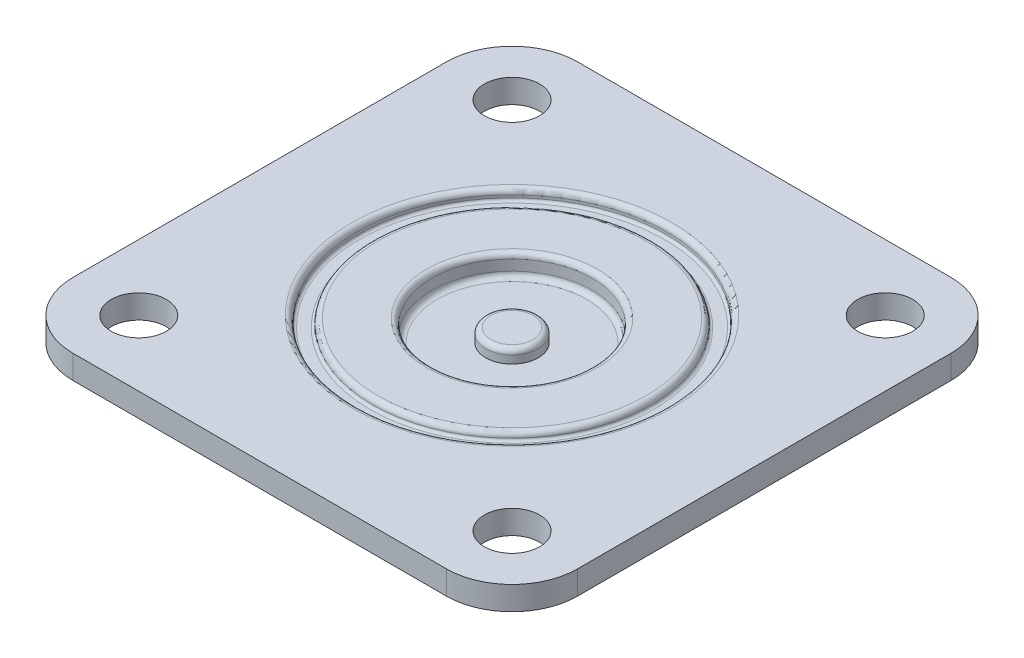
ISO-10303-21;
HEADER;
FILE_DESCRIPTION(('STEP AP214'),'2;1');
FILE_NAME('part.step','',(''),(''),'','','');
FILE_SCHEMA(('AUTOMOTIVE_DESIGN { 1 0 10303 214 1 1 1 1 }'));
ENDSEC;
DATA;
#1=APPLICATION_CONTEXT('core data for automotive mechanical design processes');
#2=APPLICATION_PROTOCOL_DEFINITION('international standard','automotive_design',2000,#1);
#3=PRODUCT_CONTEXT('',#1,'mechanical');
#4=PRODUCT('Part','Part','',(#3));
#5=PRODUCT_RELATED_PRODUCT_CATEGORY('part','',(#4));
#6=PRODUCT_DEFINITION_FORMATION('','',#4);
#7=PRODUCT_DEFINITION_CONTEXT('part definition',#1,'design');
#8=PRODUCT_DEFINITION('design','',#6,#7);
#9=PRODUCT_DEFINITION_SHAPE('','',#8);
#10=(LENGTH_UNIT() NAMED_UNIT(*) SI_UNIT(.MILLI.,.METRE.));
#11=(NAMED_UNIT(*) PLANE_ANGLE_UNIT() SI_UNIT($,.RADIAN.));
#12=(NAMED_UNIT(*) SI_UNIT($,.STERADIAN.) SOLID_ANGLE_UNIT());
#13=UNCERTAINTY_MEASURE_WITH_UNIT(LENGTH_MEASURE(1.E-05),#10,'distance_accuracy_value','');
#14=(GEOMETRIC_REPRESENTATION_CONTEXT(3) GLOBAL_UNCERTAINTY_ASSIGNED_CONTEXT((#13)) GLOBAL_UNIT_ASSIGNED_CONTEXT((#10,
#11,#12)) REPRESENTATION_CONTEXT('',''));
#15=CARTESIAN_POINT('',(0.,0.,0.));
#16=DIRECTION('',(0.,0.,1.));
#17=DIRECTION('',(1.,0.,0.));
#18=AXIS2_PLACEMENT_3D('',#15,#16,#17);
#19=CARTESIAN_POINT('',(-35.5000000000005,-4.5,35.5000000000005));
#20=DIRECTION('',(0.,1.,0.));
#21=DIRECTION('',(0.,0.,1.));
#22=AXIS2_PLACEMENT_3D('',#19,#20,#21);
#23=PLANE('',#22);
#24=CARTESIAN_POINT('',(-35.5000000000005,-4.5,35.5000000000005));
#25=DIRECTION('',(0.,1.,0.));
#26=DIRECTION('',(0.,0.,1.));
#27=AXIS2_PLACEMENT_3D('',#24,#25,#26);
#28=CIRCLE('',#27,12.4999999999995);
#29=CARTESIAN_POINT('',(-48.,-4.5,35.5));
#30=VERTEX_POINT('',#29);
#31=CARTESIAN_POINT('',(-35.5,-4.5,48.));
#32=VERTEX_POINT('',#31);
#33=EDGE_CURVE('E155',#30,#32,#28,.T.);
#34=ORIENTED_EDGE('',*,*,#33,.F.);
#35=DIRECTION('',(0.,0.,1.));
#36=VECTOR('',#35,1.);
#37=CARTESIAN_POINT('',(-48.,-4.5,-35.5));
#38=LINE('',#37,#36);
#39=CARTESIAN_POINT('',(-48.,-4.5,-35.5));
#40=VERTEX_POINT('',#39);
#41=EDGE_CURVE('E123',#40,#30,#38,.T.);
#42=ORIENTED_EDGE('',*,*,#41,.F.);
#43=CARTESIAN_POINT('',(-35.5000000000005,-4.5,-35.5000000000005));
#44=DIRECTION('',(0.,1.,0.));
#45=DIRECTION('',(0.,0.,1.));
#46=AXIS2_PLACEMENT_3D('',#43,#44,#45);
#47=CIRCLE('',#46,12.4999999999995);
#48=CARTESIAN_POINT('',(-35.5,-4.5,-48.));
#49=VERTEX_POINT('',#48);
#50=EDGE_CURVE('E108',#49,#40,#47,.T.);
#51=ORIENTED_EDGE('',*,*,#50,.F.);
#52=DIRECTION('',(-1.,0.,0.));
#53=VECTOR('',#52,1.);
#54=CARTESIAN_POINT('',(35.5,-4.5,-48.));
#55=LINE('',#54,#53);
#56=CARTESIAN_POINT('',(35.5,-4.5,-48.));
#57=VERTEX_POINT('',#56);
#58=EDGE_CURVE('E121',#57,#49,#55,.T.);
#59=ORIENTED_EDGE('',*,*,#58,.F.);
#60=CARTESIAN_POINT('',(35.5000000000005,-4.5,-35.5000000000005));
#61=DIRECTION('',(0.,1.,0.));
#62=DIRECTION('',(0.,0.,1.));
#63=AXIS2_PLACEMENT_3D('',#60,#61,#62);
#64=CIRCLE('',#63,12.4999999999995);
#65=CARTESIAN_POINT('',(48.,-4.5,-35.5));
#66=VERTEX_POINT('',#65);
#67=EDGE_CURVE('E126',#66,#57,#64,.T.);
#68=ORIENTED_EDGE('',*,*,#67,.F.);
#69=DIRECTION('',(0.,0.,-1.));
#70=VECTOR('',#69,1.);
#71=CARTESIAN_POINT('',(48.,-4.5,35.5));
#72=LINE('',#71,#70);
#73=CARTESIAN_POINT('',(48.,-4.5,35.5));
#74=VERTEX_POINT('',#73);
#75=EDGE_CURVE('E128',#74,#66,#72,.T.);
#76=ORIENTED_EDGE('',*,*,#75,.F.);
#77=CARTESIAN_POINT('',(35.5000000000005,-4.5,35.5000000000005));
#78=DIRECTION('',(0.,1.,0.));
#79=DIRECTION('',(0.,0.,1.));
#80=AXIS2_PLACEMENT_3D('',#77,#78,#79);
#81=CIRCLE('',#80,12.4999999999995);
#82=CARTESIAN_POINT('',(35.5,-4.5,48.));
#83=VERTEX_POINT('',#82);
#84=EDGE_CURVE('E224',#83,#74,#81,.T.);
#85=ORIENTED_EDGE('',*,*,#84,.F.);
#86=DIRECTION('',(1.,0.,0.));
#87=VECTOR('',#86,1.);
#88=CARTESIAN_POINT('',(-35.5,-4.5,48.));
#89=LINE('',#88,#87);
#90=EDGE_CURVE('E222',#32,#83,#89,.T.);
#91=ORIENTED_EDGE('',*,*,#90,.F.);
#92=EDGE_LOOP('',(#34,#42,#51,#59,#68,#76,#85,#91));
#93=FACE_BOUND('',#92,.T.);
#94=CARTESIAN_POINT('',(35.5000000000005,-4.5,35.5000000000005));
#95=DIRECTION('',(0.,1.,0.));
#96=DIRECTION('',(0.,0.,1.));
#97=AXIS2_PLACEMENT_3D('',#94,#95,#96);
#98=CIRCLE('',#97,5.24999999999948);
#99=CARTESIAN_POINT('',(35.5000000000005,-4.5,40.75));
#100=VERTEX_POINT('',#99);
#101=EDGE_CURVE('E137',#100,#100,#98,.T.);
#102=ORIENTED_EDGE('',*,*,#101,.T.);
#103=EDGE_LOOP('',(#102));
#104=FACE_BOUND('',#103,.T.);
#105=CARTESIAN_POINT('',(35.5000000000005,-4.5,-35.5000000000005));
#106=DIRECTION('',(0.,1.,0.));
#107=DIRECTION('',(0.,0.,1.));
#108=AXIS2_PLACEMENT_3D('',#105,#106,#107);
#109=CIRCLE('',#108,5.24999999999948);
#110=CARTESIAN_POINT('',(35.5000000000005,-4.5,-30.250000000001));
#111=VERTEX_POINT('',#110);
#112=EDGE_CURVE('E213',#111,#111,#109,.T.);
#113=ORIENTED_EDGE('',*,*,#112,.T.);
#114=EDGE_LOOP('',(#113));
#115=FACE_BOUND('',#114,.T.);
#116=CARTESIAN_POINT('',(-35.5000000000005,-4.5,35.5000000000005));
#117=DIRECTION('',(0.,1.,0.));
#118=DIRECTION('',(0.,0.,1.));
#119=AXIS2_PLACEMENT_3D('',#116,#117,#118);
#120=CIRCLE('',#119,5.25000000000052);
#121=CARTESIAN_POINT('',(-35.5000000000005,-4.5,40.750000000001));
#122=VERTEX_POINT('',#121);
#123=EDGE_CURVE('E523',#122,#122,#120,.T.);
#124=ORIENTED_EDGE('',*,*,#123,.T.);
#125=EDGE_LOOP('',(#124));
#126=FACE_BOUND('',#125,.T.);
#127=CARTESIAN_POINT('',(-35.5000000000005,-4.5,-35.5000000000005));
#128=DIRECTION('',(0.,1.,0.));
#129=DIRECTION('',(0.,0.,1.));
#130=AXIS2_PLACEMENT_3D('',#127,#128,#129);
#131=CIRCLE('',#130,5.25000000000052);
#132=CARTESIAN_POINT('',(-35.5000000000005,-4.5,-30.25));
#133=VERTEX_POINT('',#132);
#134=EDGE_CURVE('E519',#133,#133,#131,.T.);
#135=ORIENTED_EDGE('',*,*,#134,.T.);
#136=EDGE_LOOP('',(#135));
#137=FACE_BOUND('',#136,.T.);
#138=CARTESIAN_POINT('',(0.,-4.5,0.));
#139=DIRECTION('',(0.,1.,0.));
#140=DIRECTION('',(0.,0.,1.));
#141=AXIS2_PLACEMENT_3D('',#138,#139,#140);
#142=CIRCLE('',#141,35.5);
#143=CARTESIAN_POINT('',(0.,-4.5,35.5));
#144=VERTEX_POINT('',#143);
#145=EDGE_CURVE('E11',#144,#144,#142,.F.);
#146=ORIENTED_EDGE('',*,*,#145,.F.);
#147=EDGE_LOOP('',(#146));
#148=FACE_BOUND('',#147,.T.);
#149=ADVANCED_FACE('F34',(#93,#104,#115,#126,#137,#148),#23,.F.);
#150=CARTESIAN_POINT('',(-35.5000000000005,-4.5,35.5000000000005));
#151=DIRECTION('',(0.,1.,0.));
#152=DIRECTION('',(0.,0.,1.));
#153=AXIS2_PLACEMENT_3D('',#150,#151,#152);
#154=CYLINDRICAL_SURFACE('',#153,12.4999999999995);
#155=CARTESIAN_POINT('',(-35.5000000000005,0.,35.5000000000005));
#156=DIRECTION('',(0.,1.,0.));
#157=DIRECTION('',(0.,0.,1.));
#158=AXIS2_PLACEMENT_3D('',#155,#156,#157);
#159=CIRCLE('',#158,12.4999999999995);
#160=CARTESIAN_POINT('',(-48.,0.,35.5));
#161=VERTEX_POINT('',#160);
#162=CARTESIAN_POINT('',(-35.5,0.,48.));
#163=VERTEX_POINT('',#162);
#164=EDGE_CURVE('E133',#161,#163,#159,.T.);
#165=ORIENTED_EDGE('',*,*,#164,.F.);
#166=DIRECTION('',(0.,1.,0.));
#167=VECTOR('',#166,1.);
#168=CARTESIAN_POINT('',(-48.,-4.5,35.5));
#169=LINE('',#168,#167);
#170=EDGE_CURVE('E43',#30,#161,#169,.T.);
#171=ORIENTED_EDGE('',*,*,#170,.F.);
#172=ORIENTED_EDGE('',*,*,#33,.T.);
#173=DIRECTION('',(0.,1.,0.));
#174=VECTOR('',#173,1.);
#175=CARTESIAN_POINT('',(-35.5,-4.5,48.));
#176=LINE('',#175,#174);
#177=EDGE_CURVE('E91',#32,#163,#176,.T.);
#178=ORIENTED_EDGE('',*,*,#177,.T.);
#179=EDGE_LOOP('',(#165,#171,#172,#178));
#180=FACE_BOUND('',#179,.T.);
#181=ADVANCED_FACE('F36',(#180),#154,.T.);
#182=CARTESIAN_POINT('',(-48.,-4.5,-35.5));
#183=DIRECTION('',(-1.,0.,0.));
#184=DIRECTION('',(0.,0.,1.));
#185=AXIS2_PLACEMENT_3D('',#182,#183,#184);
#186=PLANE('',#185);
#187=DIRECTION('',(0.,0.,1.));
#188=VECTOR('',#187,1.);
#189=CARTESIAN_POINT('',(-48.,0.,-35.5));
#190=LINE('',#189,#188);
#191=CARTESIAN_POINT('',(-48.,0.,-35.5));
#192=VERTEX_POINT('',#191);
#193=EDGE_CURVE('E152',#192,#161,#190,.T.);
#194=ORIENTED_EDGE('',*,*,#193,.F.);
#195=DIRECTION('',(0.,1.,0.));
#196=VECTOR('',#195,1.);
#197=CARTESIAN_POINT('',(-48.,-4.5,-35.5));
#198=LINE('',#197,#196);
#199=EDGE_CURVE('E79',#40,#192,#198,.T.);
#200=ORIENTED_EDGE('',*,*,#199,.F.);
#201=ORIENTED_EDGE('',*,*,#41,.T.);
#202=ORIENTED_EDGE('',*,*,#170,.T.);
#203=EDGE_LOOP('',(#194,#200,#201,#202));
#204=FACE_BOUND('',#203,.T.);
#205=ADVANCED_FACE('F168',(#204),#186,.T.);
#206=CARTESIAN_POINT('',(-35.5000000000005,-4.5,-35.5000000000005));
#207=DIRECTION('',(0.,1.,0.));
#208=DIRECTION('',(0.,0.,1.));
#209=AXIS2_PLACEMENT_3D('',#206,#207,#208);
#210=CYLINDRICAL_SURFACE('',#209,12.4999999999995);
#211=CARTESIAN_POINT('',(-35.5000000000005,0.,-35.5000000000005));
#212=DIRECTION('',(0.,1.,0.));
#213=DIRECTION('',(0.,0.,1.));
#214=AXIS2_PLACEMENT_3D('',#211,#212,#213);
#215=CIRCLE('',#214,12.4999999999995);
#216=CARTESIAN_POINT('',(-35.5,0.,-48.));
#217=VERTEX_POINT('',#216);
#218=EDGE_CURVE('E110',#217,#192,#215,.T.);
#219=ORIENTED_EDGE('',*,*,#218,.F.);
#220=DIRECTION('',(0.,1.,0.));
#221=VECTOR('',#220,1.);
#222=CARTESIAN_POINT('',(-35.5,-4.5,-48.));
#223=LINE('',#222,#221);
#224=EDGE_CURVE('E105',#49,#217,#223,.T.);
#225=ORIENTED_EDGE('',*,*,#224,.F.);
#226=ORIENTED_EDGE('',*,*,#50,.T.);
#227=ORIENTED_EDGE('',*,*,#199,.T.);
#228=EDGE_LOOP('',(#219,#225,#226,#227));
#229=FACE_BOUND('',#228,.T.);
#230=ADVANCED_FACE('F107',(#229),#210,.T.);
#231=CARTESIAN_POINT('',(35.5,-4.5,-48.));
#232=DIRECTION('',(0.,0.,-1.));
#233=DIRECTION('',(-1.,0.,0.));
#234=AXIS2_PLACEMENT_3D('',#231,#232,#233);
#235=PLANE('',#234);
#236=DIRECTION('',(-1.,0.,0.));
#237=VECTOR('',#236,1.);
#238=CARTESIAN_POINT('',(35.5,0.,-48.));
#239=LINE('',#238,#237);
#240=CARTESIAN_POINT('',(35.5,0.,-48.));
#241=VERTEX_POINT('',#240);
#242=EDGE_CURVE('E149',#241,#217,#239,.T.);
#243=ORIENTED_EDGE('',*,*,#242,.F.);
#244=DIRECTION('',(0.,1.,0.));
#245=VECTOR('',#244,1.);
#246=CARTESIAN_POINT('',(35.5,-4.5,-48.));
#247=LINE('',#246,#245);
#248=EDGE_CURVE('E115',#57,#241,#247,.T.);
#249=ORIENTED_EDGE('',*,*,#248,.F.);
#250=ORIENTED_EDGE('',*,*,#58,.T.);
#251=ORIENTED_EDGE('',*,*,#224,.T.);
#252=EDGE_LOOP('',(#243,#249,#250,#251));
#253=FACE_BOUND('',#252,.T.);
#254=ADVANCED_FACE('F125',(#253),#235,.T.);
#255=CARTESIAN_POINT('',(35.5000000000005,-4.5,-35.5000000000005));
#256=DIRECTION('',(0.,1.,0.));
#257=DIRECTION('',(0.,0.,1.));
#258=AXIS2_PLACEMENT_3D('',#255,#256,#257);
#259=CYLINDRICAL_SURFACE('',#258,12.4999999999995);
#260=CARTESIAN_POINT('',(35.5000000000005,0.,-35.5000000000005));
#261=DIRECTION('',(0.,1.,0.));
#262=DIRECTION('',(0.,0.,1.));
#263=AXIS2_PLACEMENT_3D('',#260,#261,#262);
#264=CIRCLE('',#263,12.4999999999995);
#265=CARTESIAN_POINT('',(48.,0.,-35.5));
#266=VERTEX_POINT('',#265);
#267=EDGE_CURVE('E146',#266,#241,#264,.T.);
#268=ORIENTED_EDGE('',*,*,#267,.F.);
#269=DIRECTION('',(0.,1.,0.));
#270=VECTOR('',#269,1.);
#271=CARTESIAN_POINT('',(48.,-4.5,-35.5));
#272=LINE('',#271,#270);
#273=EDGE_CURVE('E159',#66,#266,#272,.T.);
#274=ORIENTED_EDGE('',*,*,#273,.F.);
#275=ORIENTED_EDGE('',*,*,#67,.T.);
#276=ORIENTED_EDGE('',*,*,#248,.T.);
#277=EDGE_LOOP('',(#268,#274,#275,#276));
#278=FACE_BOUND('',#277,.T.);
#279=ADVANCED_FACE('F235',(#278),#259,.T.);
#280=CARTESIAN_POINT('',(48.,-4.5,35.5));
#281=DIRECTION('',(1.,0.,0.));
#282=DIRECTION('',(0.,0.,-1.));
#283=AXIS2_PLACEMENT_3D('',#280,#281,#282);
#284=PLANE('',#283);
#285=DIRECTION('',(0.,0.,-1.));
#286=VECTOR('',#285,1.);
#287=CARTESIAN_POINT('',(48.,0.,35.5));
#288=LINE('',#287,#286);
#289=CARTESIAN_POINT('',(48.,0.,35.5));
#290=VERTEX_POINT('',#289);
#291=EDGE_CURVE('E143',#290,#266,#288,.T.);
#292=ORIENTED_EDGE('',*,*,#291,.F.);
#293=DIRECTION('',(0.,1.,0.));
#294=VECTOR('',#293,1.);
#295=CARTESIAN_POINT('',(48.,-4.5,35.5));
#296=LINE('',#295,#294);
#297=EDGE_CURVE('E161',#74,#290,#296,.T.);
#298=ORIENTED_EDGE('',*,*,#297,.F.);
#299=ORIENTED_EDGE('',*,*,#75,.T.);
#300=ORIENTED_EDGE('',*,*,#273,.T.);
#301=EDGE_LOOP('',(#292,#298,#299,#300));
#302=FACE_BOUND('',#301,.T.);
#303=ADVANCED_FACE('F230',(#302),#284,.T.);
#304=CARTESIAN_POINT('',(35.5000000000005,-4.5,35.5000000000005));
#305=DIRECTION('',(0.,1.,0.));
#306=DIRECTION('',(0.,0.,1.));
#307=AXIS2_PLACEMENT_3D('',#304,#305,#306);
#308=CYLINDRICAL_SURFACE('',#307,12.4999999999995);
#309=CARTESIAN_POINT('',(35.5000000000005,0.,35.5000000000005));
#310=DIRECTION('',(0.,1.,0.));
#311=DIRECTION('',(0.,0.,1.));
#312=AXIS2_PLACEMENT_3D('',#309,#310,#311);
#313=CIRCLE('',#312,12.4999999999995);
#314=CARTESIAN_POINT('',(35.5,0.,48.));
#315=VERTEX_POINT('',#314);
#316=EDGE_CURVE('E140',#315,#290,#313,.T.);
#317=ORIENTED_EDGE('',*,*,#316,.F.);
#318=DIRECTION('',(0.,1.,0.));
#319=VECTOR('',#318,1.);
#320=CARTESIAN_POINT('',(35.5,-4.5,48.));
#321=LINE('',#320,#319);
#322=EDGE_CURVE('E163',#83,#315,#321,.T.);
#323=ORIENTED_EDGE('',*,*,#322,.F.);
#324=ORIENTED_EDGE('',*,*,#84,.T.);
#325=ORIENTED_EDGE('',*,*,#297,.T.);
#326=EDGE_LOOP('',(#317,#323,#324,#325));
#327=FACE_BOUND('',#326,.T.);
#328=ADVANCED_FACE('F192',(#327),#308,.T.);
#329=CARTESIAN_POINT('',(-35.5,-4.5,48.));
#330=DIRECTION('',(0.,0.,1.));
#331=DIRECTION('',(1.,0.,0.));
#332=AXIS2_PLACEMENT_3D('',#329,#330,#331);
#333=PLANE('',#332);
#334=DIRECTION('',(1.,0.,0.));
#335=VECTOR('',#334,1.);
#336=CARTESIAN_POINT('',(-35.5,0.,48.));
#337=LINE('',#336,#335);
#338=EDGE_CURVE('E136',#163,#315,#337,.T.);
#339=ORIENTED_EDGE('',*,*,#338,.F.);
#340=ORIENTED_EDGE('',*,*,#177,.F.);
#341=ORIENTED_EDGE('',*,*,#90,.T.);
#342=ORIENTED_EDGE('',*,*,#322,.T.);
#343=EDGE_LOOP('',(#339,#340,#341,#342));
#344=FACE_BOUND('',#343,.T.);
#345=ADVANCED_FACE('F164',(#344),#333,.T.);
#346=CARTESIAN_POINT('',(-35.5000000000005,0.,35.5000000000005));
#347=DIRECTION('',(0.,1.,0.));
#348=DIRECTION('',(0.,0.,1.));
#349=AXIS2_PLACEMENT_3D('',#346,#347,#348);
#350=PLANE('',#349);
#351=CARTESIAN_POINT('',(0.,0.,0.));
#352=DIRECTION('',(0.,1.,0.));
#353=DIRECTION('',(0.,0.,1.));
#354=AXIS2_PLACEMENT_3D('',#351,#352,#353);
#355=CIRCLE('',#354,30.5);
#356=CARTESIAN_POINT('',(0.,0.,30.5));
#357=VERTEX_POINT('',#356);
#358=EDGE_CURVE('E196',#357,#357,#355,.T.);
#359=ORIENTED_EDGE('',*,*,#358,.F.);
#360=EDGE_LOOP('',(#359));
#361=FACE_BOUND('',#360,.T.);
#362=CARTESIAN_POINT('',(-35.5000000000005,0.,-35.5000000000005));
#363=DIRECTION('',(0.,1.,0.));
#364=DIRECTION('',(0.,0.,1.));
#365=AXIS2_PLACEMENT_3D('',#362,#363,#364);
#366=CIRCLE('',#365,5.25000000000052);
#367=CARTESIAN_POINT('',(-35.5000000000005,0.,-30.25));
#368=VERTEX_POINT('',#367);
#369=EDGE_CURVE('E200',#368,#368,#366,.T.);
#370=ORIENTED_EDGE('',*,*,#369,.F.);
#371=EDGE_LOOP('',(#370));
#372=FACE_BOUND('',#371,.T.);
#373=CARTESIAN_POINT('',(-35.5000000000005,0.,35.5000000000005));
#374=DIRECTION('',(0.,1.,0.));
#375=DIRECTION('',(0.,0.,1.));
#376=AXIS2_PLACEMENT_3D('',#373,#374,#375);
#377=CIRCLE('',#376,5.25000000000052);
#378=CARTESIAN_POINT('',(-35.5000000000005,0.,40.750000000001));
#379=VERTEX_POINT('',#378);
#380=EDGE_CURVE('E204',#379,#379,#377,.T.);
#381=ORIENTED_EDGE('',*,*,#380,.F.);
#382=EDGE_LOOP('',(#381));
#383=FACE_BOUND('',#382,.T.);
#384=CARTESIAN_POINT('',(35.5000000000005,0.,-35.5000000000005));
#385=DIRECTION('',(0.,1.,0.));
#386=DIRECTION('',(0.,0.,1.));
#387=AXIS2_PLACEMENT_3D('',#384,#385,#386);
#388=CIRCLE('',#387,5.24999999999948);
#389=CARTESIAN_POINT('',(35.5000000000005,0.,-30.250000000001));
#390=VERTEX_POINT('',#389);
#391=EDGE_CURVE('E208',#390,#390,#388,.T.);
#392=ORIENTED_EDGE('',*,*,#391,.F.);
#393=EDGE_LOOP('',(#392));
#394=FACE_BOUND('',#393,.T.);
#395=CARTESIAN_POINT('',(35.5000000000005,0.,35.5000000000005));
#396=DIRECTION('',(0.,1.,0.));
#397=DIRECTION('',(0.,0.,1.));
#398=AXIS2_PLACEMENT_3D('',#395,#396,#397);
#399=CIRCLE('',#398,5.24999999999948);
#400=CARTESIAN_POINT('',(35.5000000000005,0.,40.75));
#401=VERTEX_POINT('',#400);
#402=EDGE_CURVE('E211',#401,#401,#399,.T.);
#403=ORIENTED_EDGE('',*,*,#402,.F.);
#404=EDGE_LOOP('',(#403));
#405=FACE_BOUND('',#404,.T.);
#406=ORIENTED_EDGE('',*,*,#164,.T.);
#407=ORIENTED_EDGE('',*,*,#338,.T.);
#408=ORIENTED_EDGE('',*,*,#316,.T.);
#409=ORIENTED_EDGE('',*,*,#291,.T.);
#410=ORIENTED_EDGE('',*,*,#267,.T.);
#411=ORIENTED_EDGE('',*,*,#242,.T.);
#412=ORIENTED_EDGE('',*,*,#218,.T.);
#413=ORIENTED_EDGE('',*,*,#193,.T.);
#414=EDGE_LOOP('',(#406,#407,#408,#409,#410,#411,#412,#413));
#415=FACE_BOUND('',#414,.T.);
#416=ADVANCED_FACE('F167',(#361,#372,#383,#394,#405,#415),#350,.T.);
#417=CARTESIAN_POINT('',(35.5000000000005,-4.5,35.5000000000005));
#418=DIRECTION('',(0.,1.,0.));
#419=DIRECTION('',(0.,0.,1.));
#420=AXIS2_PLACEMENT_3D('',#417,#418,#419);
#421=CYLINDRICAL_SURFACE('',#420,5.24999999999948);
#422=ORIENTED_EDGE('',*,*,#101,.F.);
#423=EDGE_LOOP('',(#422));
#424=FACE_BOUND('',#423,.T.);
#425=ORIENTED_EDGE('',*,*,#402,.T.);
#426=EDGE_LOOP('',(#425));
#427=FACE_BOUND('',#426,.T.);
#428=ADVANCED_FACE('F182',(#424,#427),#421,.F.);
#429=CARTESIAN_POINT('',(35.5000000000005,-4.5,-35.5000000000005));
#430=DIRECTION('',(0.,1.,0.));
#431=DIRECTION('',(0.,0.,1.));
#432=AXIS2_PLACEMENT_3D('',#429,#430,#431);
#433=CYLINDRICAL_SURFACE('',#432,5.24999999999948);
#434=ORIENTED_EDGE('',*,*,#112,.F.);
#435=EDGE_LOOP('',(#434));
#436=FACE_BOUND('',#435,.T.);
#437=ORIENTED_EDGE('',*,*,#391,.T.);
#438=EDGE_LOOP('',(#437));
#439=FACE_BOUND('',#438,.T.);
#440=ADVANCED_FACE('F190',(#436,#439),#433,.F.);
#441=CARTESIAN_POINT('',(-35.5000000000005,-4.5,35.5000000000005));
#442=DIRECTION('',(0.,1.,0.));
#443=DIRECTION('',(0.,0.,1.));
#444=AXIS2_PLACEMENT_3D('',#441,#442,#443);
#445=CYLINDRICAL_SURFACE('',#444,5.25000000000052);
#446=ORIENTED_EDGE('',*,*,#123,.F.);
#447=EDGE_LOOP('',(#446));
#448=FACE_BOUND('',#447,.T.);
#449=ORIENTED_EDGE('',*,*,#380,.T.);
#450=EDGE_LOOP('',(#449));
#451=FACE_BOUND('',#450,.T.);
#452=ADVANCED_FACE('F270',(#448,#451),#445,.F.);
#453=CARTESIAN_POINT('',(-35.5000000000005,-4.5,-35.5000000000005));
#454=DIRECTION('',(0.,1.,0.));
#455=DIRECTION('',(0.,0.,1.));
#456=AXIS2_PLACEMENT_3D('',#453,#454,#455);
#457=CYLINDRICAL_SURFACE('',#456,5.25000000000052);
#458=ORIENTED_EDGE('',*,*,#134,.F.);
#459=EDGE_LOOP('',(#458));
#460=FACE_BOUND('',#459,.T.);
#461=ORIENTED_EDGE('',*,*,#369,.T.);
#462=EDGE_LOOP('',(#461));
#463=FACE_BOUND('',#462,.T.);
#464=ADVANCED_FACE('F279',(#460,#463),#457,.F.);
#465=CARTESIAN_POINT('',(0.,-15.963874529023,0.));
#466=DIRECTION('',(0.,1.,0.));
#467=DIRECTION('',(0.,0.,1.));
#468=AXIS2_PLACEMENT_3D('',#465,#466,#467);
#469=CONICAL_SURFACE('',#468,27.998946295824,0.579406826721645);
#470=ORIENTED_EDGE('',*,*,#145,.T.);
#471=EDGE_LOOP('',(#470));
#472=FACE_BOUND('',#471,.T.);
#473=CARTESIAN_POINT('',(0.,-15.963874529023,0.));
#474=DIRECTION('',(0.,1.,0.));
#475=DIRECTION('',(0.,0.,1.));
#476=AXIS2_PLACEMENT_3D('',#473,#474,#475);
#477=CIRCLE('',#476,27.998946295824);
#478=CARTESIAN_POINT('',(0.,-15.963874529023,27.998946295824));
#479=VERTEX_POINT('',#478);
#480=EDGE_CURVE('E516',#479,#479,#477,.T.);
#481=ORIENTED_EDGE('',*,*,#480,.T.);
#482=EDGE_LOOP('',(#481));
#483=FACE_BOUND('',#482,.T.);
#484=ADVANCED_FACE('F288',(#472,#483),#469,.T.);
#485=CARTESIAN_POINT('',(0.,-13.5000000000038,0.));
#486=DIRECTION('',(0.,1.,0.));
#487=DIRECTION('',(0.,0.,1.));
#488=AXIS2_PLACEMENT_3D('',#485,#486,#487);
#489=TOROIDAL_SURFACE('',#488,24.2334022042994,4.49999999999616);
#490=ORIENTED_EDGE('',*,*,#480,.F.);
#491=EDGE_LOOP('',(#490));
#492=FACE_BOUND('',#491,.T.);
#493=CARTESIAN_POINT('',(0.,-18.,0.));
#494=DIRECTION('',(0.,1.,0.));
#495=DIRECTION('',(0.,0.,1.));
#496=AXIS2_PLACEMENT_3D('',#493,#494,#495);
#497=CIRCLE('',#496,24.233402204298);
#498=CARTESIAN_POINT('',(0.,-18.,24.233402204298));
#499=VERTEX_POINT('',#498);
#500=EDGE_CURVE('E513',#499,#499,#497,.T.);
#501=ORIENTED_EDGE('',*,*,#500,.T.);
#502=EDGE_LOOP('',(#501));
#503=FACE_BOUND('',#502,.T.);
#504=ADVANCED_FACE('F303',(#492,#503),#489,.T.);
#505=CARTESIAN_POINT('',(24.233402204298,-18.,0.));
#506=DIRECTION('',(0.,1.,0.));
#507=DIRECTION('',(0.,0.,1.));
#508=AXIS2_PLACEMENT_3D('',#505,#506,#507);
#509=PLANE('',#508);
#510=ORIENTED_EDGE('',*,*,#500,.F.);
#511=EDGE_LOOP('',(#510));
#512=FACE_BOUND('',#511,.T.);
#513=ADVANCED_FACE('F313',(#512),#509,.F.);
#514=CARTESIAN_POINT('',(4.,-2.,0.));
#515=DIRECTION('',(0.,1.,0.));
#516=DIRECTION('',(0.,0.,1.));
#517=AXIS2_PLACEMENT_3D('',#514,#515,#516);
#518=PLANE('',#517);
#519=CARTESIAN_POINT('',(0.,-2.,0.));
#520=DIRECTION('',(0.,1.,0.));
#521=DIRECTION('',(0.,0.,1.));
#522=AXIS2_PLACEMENT_3D('',#519,#520,#521);
#523=CIRCLE('',#522,4.);
#524=CARTESIAN_POINT('',(0.,-2.,4.));
#525=VERTEX_POINT('',#524);
#526=EDGE_CURVE('E510',#525,#525,#523,.T.);
#527=ORIENTED_EDGE('',*,*,#526,.T.);
#528=EDGE_LOOP('',(#527));
#529=FACE_BOUND('',#528,.T.);
#530=ADVANCED_FACE('F322',(#529),#518,.T.);
#531=CARTESIAN_POINT('',(0.,-3.00000000000016,0.));
#532=DIRECTION('',(0.,1.,0.));
#533=DIRECTION('',(0.,0.,1.));
#534=AXIS2_PLACEMENT_3D('',#531,#532,#533);
#535=TOROIDAL_SURFACE('',#534,3.99999999999984,1.00000000000016);
#536=CARTESIAN_POINT('',(0.,-3.,0.));
#537=DIRECTION('',(0.,1.,0.));
#538=DIRECTION('',(0.,0.,1.));
#539=AXIS2_PLACEMENT_3D('',#536,#537,#538);
#540=CIRCLE('',#539,5.);
#541=CARTESIAN_POINT('',(0.,-3.,5.));
#542=VERTEX_POINT('',#541);
#543=EDGE_CURVE('E507',#542,#542,#540,.T.);
#544=ORIENTED_EDGE('',*,*,#543,.T.);
#545=EDGE_LOOP('',(#544));
#546=FACE_BOUND('',#545,.T.);
#547=ORIENTED_EDGE('',*,*,#526,.F.);
#548=EDGE_LOOP('',(#547));
#549=FACE_BOUND('',#548,.T.);
#550=ADVANCED_FACE('F336',(#546,#549),#535,.T.);
#551=CARTESIAN_POINT('',(0.,-2.,0.));
#552=DIRECTION('',(0.,1.,0.));
#553=DIRECTION('',(0.,0.,1.));
#554=AXIS2_PLACEMENT_3D('',#551,#552,#553);
#555=CYLINDRICAL_SURFACE('',#554,5.);
#556=CARTESIAN_POINT('',(0.,-4.5,0.));
#557=DIRECTION('',(0.,1.,0.));
#558=DIRECTION('',(0.,0.,1.));
#559=AXIS2_PLACEMENT_3D('',#556,#557,#558);
#560=CIRCLE('',#559,5.);
#561=CARTESIAN_POINT('',(0.,-4.5,5.));
#562=VERTEX_POINT('',#561);
#563=EDGE_CURVE('E504',#562,#562,#560,.T.);
#564=ORIENTED_EDGE('',*,*,#563,.T.);
#565=EDGE_LOOP('',(#564));
#566=FACE_BOUND('',#565,.T.);
#567=ORIENTED_EDGE('',*,*,#543,.F.);
#568=EDGE_LOOP('',(#567));
#569=FACE_BOUND('',#568,.T.);
#570=ADVANCED_FACE('F346',(#566,#569),#555,.T.);
#571=CARTESIAN_POINT('',(14.25,-4.5,0.));
#572=DIRECTION('',(0.,1.,0.));
#573=DIRECTION('',(0.,0.,1.));
#574=AXIS2_PLACEMENT_3D('',#571,#572,#573);
#575=PLANE('',#574);
#576=CARTESIAN_POINT('',(0.,-4.5,0.));
#577=DIRECTION('',(0.,1.,0.));
#578=DIRECTION('',(0.,0.,1.));
#579=AXIS2_PLACEMENT_3D('',#576,#577,#578);
#580=CIRCLE('',#579,14.25);
#581=CARTESIAN_POINT('',(0.,-4.5,14.25));
#582=VERTEX_POINT('',#581);
#583=EDGE_CURVE('E501',#582,#582,#580,.T.);
#584=ORIENTED_EDGE('',*,*,#583,.T.);
#585=EDGE_LOOP('',(#584));
#586=FACE_BOUND('',#585,.T.);
#587=ORIENTED_EDGE('',*,*,#563,.F.);
#588=EDGE_LOOP('',(#587));
#589=FACE_BOUND('',#588,.T.);
#590=ADVANCED_FACE('F356',(#586,#589),#575,.T.);
#591=CARTESIAN_POINT('',(0.,-3.50000000000069,0.));
#592=DIRECTION('',(0.,1.,0.));
#593=DIRECTION('',(0.,0.,1.));
#594=AXIS2_PLACEMENT_3D('',#591,#592,#593);
#595=TOROIDAL_SURFACE('',#594,14.2500000000007,0.999999999999308);
#596=CARTESIAN_POINT('',(0.,-3.5,0.));
#597=DIRECTION('',(0.,1.,0.));
#598=DIRECTION('',(0.,0.,1.));
#599=AXIS2_PLACEMENT_3D('',#596,#597,#598);
#600=CIRCLE('',#599,15.25);
#601=CARTESIAN_POINT('',(0.,-3.5,15.25));
#602=VERTEX_POINT('',#601);
#603=EDGE_CURVE('E498',#602,#602,#600,.T.);
#604=ORIENTED_EDGE('',*,*,#603,.T.);
#605=EDGE_LOOP('',(#604));
#606=FACE_BOUND('',#605,.T.);
#607=ORIENTED_EDGE('',*,*,#583,.F.);
#608=EDGE_LOOP('',(#607));
#609=FACE_BOUND('',#608,.T.);
#610=ADVANCED_FACE('F366',(#606,#609),#595,.F.);
#611=CARTESIAN_POINT('',(0.,-2.,0.));
#612=DIRECTION('',(0.,1.,0.));
#613=DIRECTION('',(0.,0.,1.));
#614=AXIS2_PLACEMENT_3D('',#611,#612,#613);
#615=CYLINDRICAL_SURFACE('',#614,15.25);
#616=CARTESIAN_POINT('',(0.,-1.5,0.));
#617=DIRECTION('',(0.,1.,0.));
#618=DIRECTION('',(0.,0.,1.));
#619=AXIS2_PLACEMENT_3D('',#616,#617,#618);
#620=CIRCLE('',#619,15.25);
#621=CARTESIAN_POINT('',(0.,-1.5,15.25));
#622=VERTEX_POINT('',#621);
#623=EDGE_CURVE('E495',#622,#622,#620,.T.);
#624=ORIENTED_EDGE('',*,*,#623,.T.);
#625=EDGE_LOOP('',(#624));
#626=FACE_BOUND('',#625,.T.);
#627=ORIENTED_EDGE('',*,*,#603,.F.);
#628=EDGE_LOOP('',(#627));
#629=FACE_BOUND('',#628,.T.);
#630=ADVANCED_FACE('F376',(#626,#629),#615,.F.);
#631=CARTESIAN_POINT('',(0.,-1.49999999999922,0.));
#632=DIRECTION('',(0.,1.,0.));
#633=DIRECTION('',(0.,0.,1.));
#634=AXIS2_PLACEMENT_3D('',#631,#632,#633);
#635=TOROIDAL_SURFACE('',#634,16.2499999999992,0.999999999999221);
#636=CARTESIAN_POINT('',(0.,-0.5,0.));
#637=DIRECTION('',(0.,1.,0.));
#638=DIRECTION('',(0.,0.,1.));
#639=AXIS2_PLACEMENT_3D('',#636,#637,#638);
#640=CIRCLE('',#639,16.25);
#641=CARTESIAN_POINT('',(0.,-0.5,16.25));
#642=VERTEX_POINT('',#641);
#643=EDGE_CURVE('E492',#642,#642,#640,.T.);
#644=ORIENTED_EDGE('',*,*,#643,.T.);
#645=EDGE_LOOP('',(#644));
#646=FACE_BOUND('',#645,.T.);
#647=ORIENTED_EDGE('',*,*,#623,.F.);
#648=EDGE_LOOP('',(#647));
#649=FACE_BOUND('',#648,.T.);
#650=ADVANCED_FACE('F386',(#646,#649),#635,.T.);
#651=CARTESIAN_POINT('',(25.5,-0.5,0.));
#652=DIRECTION('',(0.,1.,0.));
#653=DIRECTION('',(0.,0.,1.));
#654=AXIS2_PLACEMENT_3D('',#651,#652,#653);
#655=PLANE('',#654);
#656=CARTESIAN_POINT('',(0.,-0.5,0.));
#657=DIRECTION('',(0.,1.,0.));
#658=DIRECTION('',(0.,0.,1.));
#659=AXIS2_PLACEMENT_3D('',#656,#657,#658);
#660=CIRCLE('',#659,25.5);
#661=CARTESIAN_POINT('',(0.,-0.5,25.5));
#662=VERTEX_POINT('',#661);
#663=EDGE_CURVE('E489',#662,#662,#660,.T.);
#664=ORIENTED_EDGE('',*,*,#663,.T.);
#665=EDGE_LOOP('',(#664));
#666=FACE_BOUND('',#665,.T.);
#667=ORIENTED_EDGE('',*,*,#643,.F.);
#668=EDGE_LOOP('',(#667));
#669=FACE_BOUND('',#668,.T.);
#670=ADVANCED_FACE('F396',(#666,#669),#655,.T.);
#671=CARTESIAN_POINT('',(0.,-1.49999999999922,0.));
#672=DIRECTION('',(0.,1.,0.));
#673=DIRECTION('',(0.,0.,1.));
#674=AXIS2_PLACEMENT_3D('',#671,#672,#673);
#675=TOROIDAL_SURFACE('',#674,25.5000000000008,0.99999999999922);
#676=CARTESIAN_POINT('',(0.,-1.5,0.));
#677=DIRECTION('',(0.,1.,0.));
#678=DIRECTION('',(0.,0.,1.));
#679=AXIS2_PLACEMENT_3D('',#676,#677,#678);
#680=CIRCLE('',#679,26.5);
#681=CARTESIAN_POINT('',(0.,-1.5,26.5));
#682=VERTEX_POINT('',#681);
#683=EDGE_CURVE('E486',#682,#682,#680,.T.);
#684=ORIENTED_EDGE('',*,*,#683,.T.);
#685=EDGE_LOOP('',(#684));
#686=FACE_BOUND('',#685,.T.);
#687=ORIENTED_EDGE('',*,*,#663,.F.);
#688=EDGE_LOOP('',(#687));
#689=FACE_BOUND('',#688,.T.);
#690=ADVANCED_FACE('F406',(#686,#689),#675,.T.);
#691=CARTESIAN_POINT('',(0.,-1.49999999999958,0.));
#692=DIRECTION('',(0.,1.,0.));
#693=DIRECTION('',(0.,0.,1.));
#694=AXIS2_PLACEMENT_3D('',#691,#692,#693);
#695=TOROIDAL_SURFACE('',#694,27.0000000000004,0.500000000000423);
#696=CARTESIAN_POINT('',(0.,-2.,0.));
#697=DIRECTION('',(0.,1.,0.));
#698=DIRECTION('',(0.,0.,1.));
#699=AXIS2_PLACEMENT_3D('',#696,#697,#698);
#700=CIRCLE('',#699,27.);
#701=CARTESIAN_POINT('',(0.,-2.,27.));
#702=VERTEX_POINT('',#701);
#703=EDGE_CURVE('E483',#702,#702,#700,.T.);
#704=ORIENTED_EDGE('',*,*,#703,.T.);
#705=EDGE_LOOP('',(#704));
#706=FACE_BOUND('',#705,.T.);
#707=ORIENTED_EDGE('',*,*,#683,.F.);
#708=EDGE_LOOP('',(#707));
#709=FACE_BOUND('',#708,.T.);
#710=ADVANCED_FACE('F416',(#706,#709),#695,.F.);
#711=CARTESIAN_POINT('',(29.,-2.,0.));
#712=DIRECTION('',(0.,1.,0.));
#713=DIRECTION('',(0.,0.,1.));
#714=AXIS2_PLACEMENT_3D('',#711,#712,#713);
#715=PLANE('',#714);
#716=CARTESIAN_POINT('',(0.,-2.,0.));
#717=DIRECTION('',(0.,1.,0.));
#718=DIRECTION('',(0.,0.,1.));
#719=AXIS2_PLACEMENT_3D('',#716,#717,#718);
#720=CIRCLE('',#719,29.);
#721=CARTESIAN_POINT('',(0.,-2.,29.));
#722=VERTEX_POINT('',#721);
#723=EDGE_CURVE('E477',#722,#722,#720,.T.);
#724=ORIENTED_EDGE('',*,*,#723,.T.);
#725=EDGE_LOOP('',(#724));
#726=FACE_BOUND('',#725,.T.);
#727=ORIENTED_EDGE('',*,*,#703,.F.);
#728=EDGE_LOOP('',(#727));
#729=FACE_BOUND('',#728,.T.);
#730=ADVANCED_FACE('F426',(#726,#729),#715,.T.);
#731=CARTESIAN_POINT('',(0.,-1.49999999999958,0.));
#732=DIRECTION('',(0.,1.,0.));
#733=DIRECTION('',(0.,0.,1.));
#734=AXIS2_PLACEMENT_3D('',#731,#732,#733);
#735=TOROIDAL_SURFACE('',#734,28.9999999999996,0.500000000000422);
#736=CARTESIAN_POINT('',(0.,-1.5,0.));
#737=DIRECTION('',(0.,1.,0.));
#738=DIRECTION('',(0.,0.,1.));
#739=AXIS2_PLACEMENT_3D('',#736,#737,#738);
#740=CIRCLE('',#739,29.5);
#741=CARTESIAN_POINT('',(0.,-1.5,29.5));
#742=VERTEX_POINT('',#741);
#743=EDGE_CURVE('E474',#742,#742,#740,.T.);
#744=ORIENTED_EDGE('',*,*,#743,.T.);
#745=EDGE_LOOP('',(#744));
#746=FACE_BOUND('',#745,.T.);
#747=ORIENTED_EDGE('',*,*,#723,.F.);
#748=EDGE_LOOP('',(#747));
#749=FACE_BOUND('',#748,.T.);
#750=ADVANCED_FACE('F436',(#746,#749),#735,.F.);
#751=CARTESIAN_POINT('',(0.,-2.,0.));
#752=DIRECTION('',(0.,1.,0.));
#753=DIRECTION('',(0.,0.,1.));
#754=AXIS2_PLACEMENT_3D('',#751,#752,#753);
#755=CYLINDRICAL_SURFACE('',#754,29.5);
#756=CARTESIAN_POINT('',(0.,-1.,0.));
#757=DIRECTION('',(0.,1.,0.));
#758=DIRECTION('',(0.,0.,1.));
#759=AXIS2_PLACEMENT_3D('',#756,#757,#758);
#760=CIRCLE('',#759,29.5);
#761=CARTESIAN_POINT('',(0.,-1.,29.5));
#762=VERTEX_POINT('',#761);
#763=EDGE_CURVE('E473',#762,#762,#760,.T.);
#764=ORIENTED_EDGE('',*,*,#763,.T.);
#765=EDGE_LOOP('',(#764));
#766=FACE_BOUND('',#765,.T.);
#767=ORIENTED_EDGE('',*,*,#743,.F.);
#768=EDGE_LOOP('',(#767));
#769=FACE_BOUND('',#768,.T.);
#770=ADVANCED_FACE('F446',(#766,#769),#755,.F.);
#771=CARTESIAN_POINT('',(0.,-0.999999999999222,0.));
#772=DIRECTION('',(0.,1.,0.));
#773=DIRECTION('',(0.,0.,1.));
#774=AXIS2_PLACEMENT_3D('',#771,#772,#773);
#775=TOROIDAL_SURFACE('',#774,30.4999999999992,0.999999999999223);
#776=ORIENTED_EDGE('',*,*,#358,.T.);
#777=EDGE_LOOP('',(#776));
#778=FACE_BOUND('',#777,.T.);
#779=ORIENTED_EDGE('',*,*,#763,.F.);
#780=EDGE_LOOP('',(#779));
#781=FACE_BOUND('',#780,.T.);
#782=ADVANCED_FACE('F456',(#778,#781),#775,.T.);
#783=CLOSED_SHELL('',(#149,#181,#205,#230,#254,#279,#303,#328,#345,#416,#428,#440,#452,#464,
#484,#504,#513,#530,#550,#570,#590,#610,#630,#650,#670,#690,#710,#730,#750,#770,#782));
#784=MANIFOLD_SOLID_BREP('B2',#783);
#785=ADVANCED_BREP_SHAPE_REPRESENTATION('',(#18,#784),#14);
#786=SHAPE_DEFINITION_REPRESENTATION(#9,#785);
ENDSEC;
END-ISO-10303-21;
